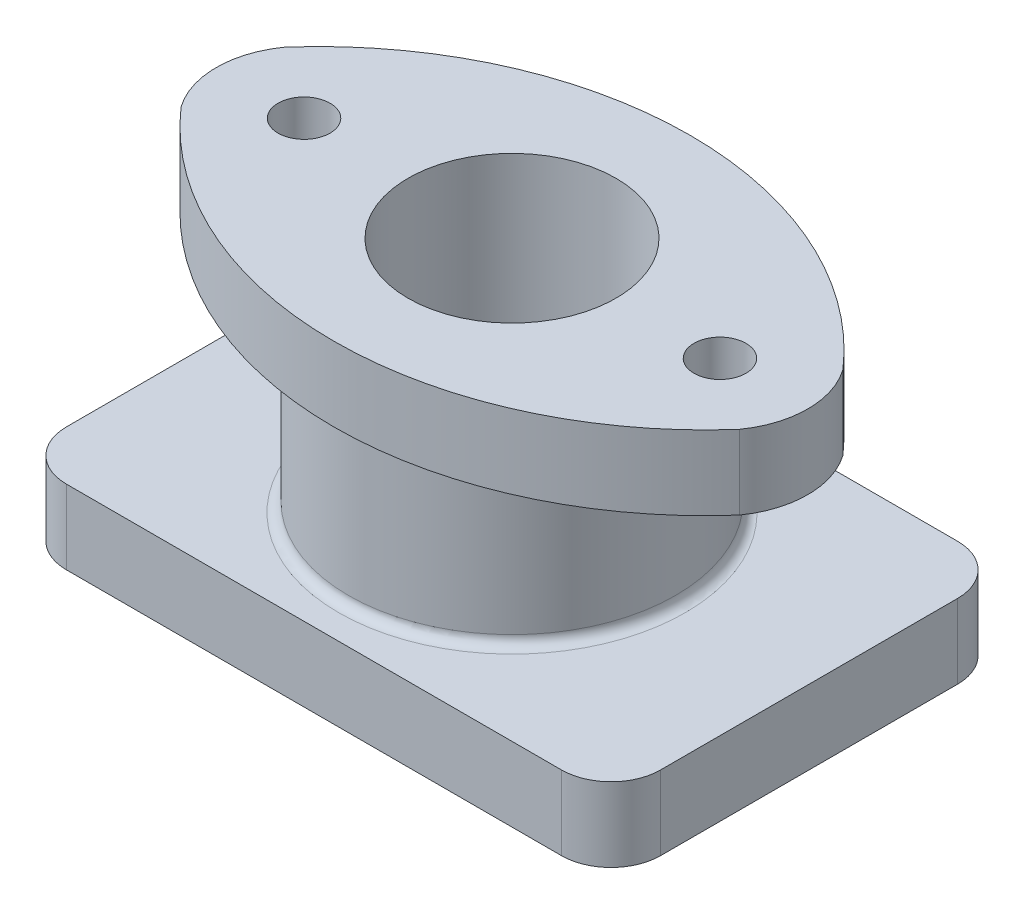
ISO-10303-21;
HEADER;
FILE_DESCRIPTION(('STEP AP214'),'2;1');
FILE_NAME('part.step','',(''),(''),'','','');
FILE_SCHEMA(('AUTOMOTIVE_DESIGN { 1 0 10303 214 1 1 1 1 }'));
ENDSEC;
DATA;
#1=APPLICATION_CONTEXT('core data for automotive mechanical design processes');
#2=APPLICATION_PROTOCOL_DEFINITION('international standard','automotive_design',2000,#1);
#3=PRODUCT_CONTEXT('',#1,'mechanical');
#4=PRODUCT('Part','Part','',(#3));
#5=PRODUCT_RELATED_PRODUCT_CATEGORY('part','',(#4));
#6=PRODUCT_DEFINITION_FORMATION('','',#4);
#7=PRODUCT_DEFINITION_CONTEXT('part definition',#1,'design');
#8=PRODUCT_DEFINITION('design','',#6,#7);
#9=PRODUCT_DEFINITION_SHAPE('','',#8);
#10=(LENGTH_UNIT() NAMED_UNIT(*) SI_UNIT(.MILLI.,.METRE.));
#11=(NAMED_UNIT(*) PLANE_ANGLE_UNIT() SI_UNIT($,.RADIAN.));
#12=(NAMED_UNIT(*) SI_UNIT($,.STERADIAN.) SOLID_ANGLE_UNIT());
#13=UNCERTAINTY_MEASURE_WITH_UNIT(LENGTH_MEASURE(1.E-05),#10,'distance_accuracy_value','');
#14=(GEOMETRIC_REPRESENTATION_CONTEXT(3) GLOBAL_UNCERTAINTY_ASSIGNED_CONTEXT((#13)) GLOBAL_UNIT_ASSIGNED_CONTEXT((#10,
#11,#12)) REPRESENTATION_CONTEXT('',''));
#15=CARTESIAN_POINT('',(0.,0.,0.));
#16=DIRECTION('',(0.,0.,1.));
#17=DIRECTION('',(1.,0.,0.));
#18=AXIS2_PLACEMENT_3D('',#15,#16,#17);
#19=CARTESIAN_POINT('',(-20.866626987407,63.,19.5));
#20=DIRECTION('',(0.,-1.,0.));
#21=DIRECTION('',(0.,0.,-1.));
#22=AXIS2_PLACEMENT_3D('',#19,#20,#21);
#23=PLANE('',#22);
#24=CARTESIAN_POINT('',(-42.,63.,0.));
#25=DIRECTION('',(0.,1.,0.));
#26=DIRECTION('',(0.,0.,1.));
#27=AXIS2_PLACEMENT_3D('',#24,#25,#26);
#28=CIRCLE('',#27,5.24999999999999);
#29=CARTESIAN_POINT('',(-42.,63.,5.24999999999999));
#30=VERTEX_POINT('',#29);
#31=EDGE_CURVE('E525',#30,#30,#28,.T.);
#32=ORIENTED_EDGE('',*,*,#31,.F.);
#33=EDGE_LOOP('',(#32));
#34=FACE_BOUND('',#33,.T.);
#35=CARTESIAN_POINT('',(0.,63.,0.));
#36=DIRECTION('',(0.,1.,0.));
#37=DIRECTION('',(0.,0.,1.));
#38=AXIS2_PLACEMENT_3D('',#35,#36,#37);
#39=CIRCLE('',#38,21.);
#40=CARTESIAN_POINT('',(0.,63.,21.));
#41=VERTEX_POINT('',#40);
#42=EDGE_CURVE('E491',#41,#41,#39,.T.);
#43=ORIENTED_EDGE('',*,*,#42,.F.);
#44=EDGE_LOOP('',(#43));
#45=FACE_BOUND('',#44,.T.);
#46=CARTESIAN_POINT('',(-41.7332539748139,63.,0.));
#47=DIRECTION('',(0.,1.,0.));
#48=DIRECTION('',(0.,0.,-1.));
#49=AXIS2_PLACEMENT_3D('',#46,#47,#48);
#50=CIRCLE('',#49,18.);
#51=CARTESIAN_POINT('',(-56.3910463339918,63.,-10.4474457718251));
#52=VERTEX_POINT('',#51);
#53=CARTESIAN_POINT('',(-56.3910463339919,63.,10.4474457718251));
#54=VERTEX_POINT('',#53);
#55=EDGE_CURVE('E137',#52,#54,#50,.T.);
#56=ORIENTED_EDGE('',*,*,#55,.T.);
#57=CARTESIAN_POINT('',(0.,63.,-39.));
#58=DIRECTION('',(0.,1.,0.));
#59=DIRECTION('',(0.,0.,1.));
#60=AXIS2_PLACEMENT_3D('',#57,#58,#59);
#61=CIRCLE('',#60,75.);
#62=CARTESIAN_POINT('',(56.3910463339916,63.,10.447445771825));
#63=VERTEX_POINT('',#62);
#64=EDGE_CURVE('E126',#54,#63,#61,.T.);
#65=ORIENTED_EDGE('',*,*,#64,.T.);
#66=CARTESIAN_POINT('',(41.7332539748139,63.,-4.58128024125748E-13));
#67=DIRECTION('',(0.,1.,0.));
#68=DIRECTION('',(0.,0.,1.));
#69=AXIS2_PLACEMENT_3D('',#66,#67,#68);
#70=CIRCLE('',#69,18.);
#71=CARTESIAN_POINT('',(56.3910463339918,63.,-10.4474457718251));
#72=VERTEX_POINT('',#71);
#73=EDGE_CURVE('E136',#63,#72,#70,.T.);
#74=ORIENTED_EDGE('',*,*,#73,.T.);
#75=CARTESIAN_POINT('',(0.,63.,39.));
#76=DIRECTION('',(0.,1.,0.));
#77=DIRECTION('',(0.,0.,-1.));
#78=AXIS2_PLACEMENT_3D('',#75,#76,#77);
#79=CIRCLE('',#78,75.);
#80=EDGE_CURVE('E142',#72,#52,#79,.T.);
#81=ORIENTED_EDGE('',*,*,#80,.T.);
#82=EDGE_LOOP('',(#56,#65,#74,#81));
#83=FACE_BOUND('',#82,.T.);
#84=CARTESIAN_POINT('',(42.,63.,0.));
#85=DIRECTION('',(0.,1.,0.));
#86=DIRECTION('',(0.,0.,1.));
#87=AXIS2_PLACEMENT_3D('',#84,#85,#86);
#88=CIRCLE('',#87,5.24999999999999);
#89=CARTESIAN_POINT('',(42.,63.,5.24999999999996));
#90=VERTEX_POINT('',#89);
#91=EDGE_CURVE('E519',#90,#90,#88,.T.);
#92=ORIENTED_EDGE('',*,*,#91,.F.);
#93=EDGE_LOOP('',(#92));
#94=FACE_BOUND('',#93,.T.);
#95=ADVANCED_FACE('F37',(#34,#45,#83,#94),#23,.F.);
#96=CARTESIAN_POINT('',(60.0000000000001,15.,-40.));
#97=DIRECTION('',(-1.,0.,0.));
#98=DIRECTION('',(0.,0.,1.));
#99=AXIS2_PLACEMENT_3D('',#96,#97,#98);
#100=PLANE('',#99);
#101=DIRECTION('',(0.,0.,-1.));
#102=VECTOR('',#101,1.);
#103=CARTESIAN_POINT('',(60.0000000000001,0.,-40.));
#104=LINE('',#103,#102);
#105=CARTESIAN_POINT('',(59.9999999999997,0.,30.0000000000001));
#106=VERTEX_POINT('',#105);
#107=CARTESIAN_POINT('',(60.,0.,-29.9999999999999));
#108=VERTEX_POINT('',#107);
#109=EDGE_CURVE('E151',#106,#108,#104,.T.);
#110=ORIENTED_EDGE('',*,*,#109,.T.);
#111=DIRECTION('',(0.,-1.,0.));
#112=VECTOR('',#111,1.);
#113=CARTESIAN_POINT('',(60.,15.,-29.9999999999999));
#114=LINE('',#113,#112);
#115=CARTESIAN_POINT('',(60.,15.,-29.9999999999999));
#116=VERTEX_POINT('',#115);
#117=EDGE_CURVE('E217',#108,#116,#114,.F.);
#118=ORIENTED_EDGE('',*,*,#117,.T.);
#119=DIRECTION('',(0.,0.,-1.));
#120=VECTOR('',#119,1.);
#121=CARTESIAN_POINT('',(60.0000000000001,15.,-40.));
#122=LINE('',#121,#120);
#123=CARTESIAN_POINT('',(59.9999999999997,15.,30.0000000000001));
#124=VERTEX_POINT('',#123);
#125=EDGE_CURVE('E160',#124,#116,#122,.T.);
#126=ORIENTED_EDGE('',*,*,#125,.F.);
#127=DIRECTION('',(0.,-1.,0.));
#128=VECTOR('',#127,1.);
#129=CARTESIAN_POINT('',(59.9999999999997,15.,30.0000000000001));
#130=LINE('',#129,#128);
#131=EDGE_CURVE('E214',#124,#106,#130,.T.);
#132=ORIENTED_EDGE('',*,*,#131,.T.);
#133=EDGE_LOOP('',(#110,#118,#126,#132));
#134=FACE_BOUND('',#133,.T.);
#135=ADVANCED_FACE('F233',(#134),#100,.F.);
#136=CARTESIAN_POINT('',(-60.0000000000005,15.,-40.));
#137=DIRECTION('',(0.,0.,1.));
#138=DIRECTION('',(1.,0.,0.));
#139=AXIS2_PLACEMENT_3D('',#136,#137,#138);
#140=PLANE('',#139);
#141=DIRECTION('',(-1.,0.,0.));
#142=VECTOR('',#141,1.);
#143=CARTESIAN_POINT('',(-60.0000000000005,0.,-40.));
#144=LINE('',#143,#142);
#145=CARTESIAN_POINT('',(50.,0.,-40.));
#146=VERTEX_POINT('',#145);
#147=CARTESIAN_POINT('',(-50.0000000000005,0.,-40.));
#148=VERTEX_POINT('',#147);
#149=EDGE_CURVE('E154',#146,#148,#144,.T.);
#150=ORIENTED_EDGE('',*,*,#149,.T.);
#151=DIRECTION('',(0.,-1.,0.));
#152=VECTOR('',#151,1.);
#153=CARTESIAN_POINT('',(-50.0000000000005,15.,-40.));
#154=LINE('',#153,#152);
#155=CARTESIAN_POINT('',(-50.0000000000005,15.,-40.));
#156=VERTEX_POINT('',#155);
#157=EDGE_CURVE('E205',#148,#156,#154,.F.);
#158=ORIENTED_EDGE('',*,*,#157,.T.);
#159=DIRECTION('',(-1.,0.,0.));
#160=VECTOR('',#159,1.);
#161=CARTESIAN_POINT('',(-60.0000000000005,15.,-40.));
#162=LINE('',#161,#160);
#163=CARTESIAN_POINT('',(50.,15.,-40.));
#164=VERTEX_POINT('',#163);
#165=EDGE_CURVE('E163',#164,#156,#162,.T.);
#166=ORIENTED_EDGE('',*,*,#165,.F.);
#167=DIRECTION('',(0.,-1.,0.));
#168=VECTOR('',#167,1.);
#169=CARTESIAN_POINT('',(50.,15.,-40.));
#170=LINE('',#169,#168);
#171=EDGE_CURVE('E202',#164,#146,#170,.T.);
#172=ORIENTED_EDGE('',*,*,#171,.T.);
#173=EDGE_LOOP('',(#150,#158,#166,#172));
#174=FACE_BOUND('',#173,.T.);
#175=ADVANCED_FACE('F243',(#174),#140,.F.);
#176=CARTESIAN_POINT('',(-60.0000000000005,15.,-40.));
#177=DIRECTION('',(1.,0.,0.));
#178=DIRECTION('',(0.,0.,-1.));
#179=AXIS2_PLACEMENT_3D('',#176,#177,#178);
#180=PLANE('',#179);
#181=DIRECTION('',(0.,0.,1.));
#182=VECTOR('',#181,1.);
#183=CARTESIAN_POINT('',(-60.0000000000005,15.,-40.));
#184=LINE('',#183,#182);
#185=CARTESIAN_POINT('',(-60.0000000000005,15.,-30.));
#186=VERTEX_POINT('',#185);
#187=CARTESIAN_POINT('',(-60.0000000000005,15.,30.));
#188=VERTEX_POINT('',#187);
#189=EDGE_CURVE('E167',#186,#188,#184,.T.);
#190=ORIENTED_EDGE('',*,*,#189,.F.);
#191=DIRECTION('',(0.,-1.,0.));
#192=VECTOR('',#191,1.);
#193=CARTESIAN_POINT('',(-60.0000000000005,15.,-30.));
#194=LINE('',#193,#192);
#195=CARTESIAN_POINT('',(-60.0000000000005,0.,-30.));
#196=VERTEX_POINT('',#195);
#197=EDGE_CURVE('E191',#186,#196,#194,.T.);
#198=ORIENTED_EDGE('',*,*,#197,.T.);
#199=DIRECTION('',(0.,0.,1.));
#200=VECTOR('',#199,1.);
#201=CARTESIAN_POINT('',(-60.0000000000005,0.,-40.));
#202=LINE('',#201,#200);
#203=CARTESIAN_POINT('',(-60.0000000000005,0.,30.));
#204=VERTEX_POINT('',#203);
#205=EDGE_CURVE('E174',#196,#204,#202,.T.);
#206=ORIENTED_EDGE('',*,*,#205,.T.);
#207=DIRECTION('',(0.,-1.,0.));
#208=VECTOR('',#207,1.);
#209=CARTESIAN_POINT('',(-60.0000000000005,15.,30.));
#210=LINE('',#209,#208);
#211=EDGE_CURVE('E189',#204,#188,#210,.F.);
#212=ORIENTED_EDGE('',*,*,#211,.T.);
#213=EDGE_LOOP('',(#190,#198,#206,#212));
#214=FACE_BOUND('',#213,.T.);
#215=ADVANCED_FACE('F251',(#214),#180,.F.);
#216=CARTESIAN_POINT('',(-60.0000000000005,15.,40.));
#217=DIRECTION('',(0.,0.,-1.));
#218=DIRECTION('',(-1.,0.,0.));
#219=AXIS2_PLACEMENT_3D('',#216,#217,#218);
#220=PLANE('',#219);
#221=DIRECTION('',(1.,0.,0.));
#222=VECTOR('',#221,1.);
#223=CARTESIAN_POINT('',(-60.0000000000005,0.,40.));
#224=LINE('',#223,#222);
#225=CARTESIAN_POINT('',(-50.0000000000005,0.,40.));
#226=VERTEX_POINT('',#225);
#227=CARTESIAN_POINT('',(49.9999999999997,0.,40.));
#228=VERTEX_POINT('',#227);
#229=EDGE_CURVE('E164',#226,#228,#224,.T.);
#230=ORIENTED_EDGE('',*,*,#229,.T.);
#231=DIRECTION('',(0.,-1.,0.));
#232=VECTOR('',#231,1.);
#233=CARTESIAN_POINT('',(49.9999999999997,15.,40.));
#234=LINE('',#233,#232);
#235=CARTESIAN_POINT('',(49.9999999999997,15.,40.));
#236=VERTEX_POINT('',#235);
#237=EDGE_CURVE('E11',#228,#236,#234,.F.);
#238=ORIENTED_EDGE('',*,*,#237,.T.);
#239=DIRECTION('',(1.,0.,0.));
#240=VECTOR('',#239,1.);
#241=CARTESIAN_POINT('',(-60.0000000000005,15.,40.));
#242=LINE('',#241,#240);
#243=CARTESIAN_POINT('',(-50.0000000000005,15.,40.));
#244=VERTEX_POINT('',#243);
#245=EDGE_CURVE('E169',#244,#236,#242,.T.);
#246=ORIENTED_EDGE('',*,*,#245,.F.);
#247=DIRECTION('',(0.,-1.,0.));
#248=VECTOR('',#247,1.);
#249=CARTESIAN_POINT('',(-50.0000000000005,15.,40.));
#250=LINE('',#249,#248);
#251=EDGE_CURVE('E45',#244,#226,#250,.T.);
#252=ORIENTED_EDGE('',*,*,#251,.T.);
#253=EDGE_LOOP('',(#230,#238,#246,#252));
#254=FACE_BOUND('',#253,.T.);
#255=ADVANCED_FACE('F221',(#254),#220,.F.);
#256=CARTESIAN_POINT('',(0.,15.,0.));
#257=DIRECTION('',(0.,1.,0.));
#258=DIRECTION('',(0.,0.,1.));
#259=AXIS2_PLACEMENT_3D('',#256,#257,#258);
#260=PLANE('',#259);
#261=CARTESIAN_POINT('',(0.,15.,0.));
#262=DIRECTION('',(0.,1.,0.));
#263=DIRECTION('',(0.,0.,1.));
#264=AXIS2_PLACEMENT_3D('',#261,#262,#263);
#265=CIRCLE('',#264,35.);
#266=CARTESIAN_POINT('',(0.,15.,35.));
#267=VERTEX_POINT('',#266);
#268=EDGE_CURVE('E170',#267,#267,#265,.F.);
#269=ORIENTED_EDGE('',*,*,#268,.T.);
#270=EDGE_LOOP('',(#269));
#271=FACE_BOUND('',#270,.T.);
#272=ORIENTED_EDGE('',*,*,#165,.T.);
#273=CARTESIAN_POINT('',(-50.0000000000005,15.,-30.));
#274=DIRECTION('',(0.,1.,0.));
#275=DIRECTION('',(0.,0.,1.));
#276=AXIS2_PLACEMENT_3D('',#273,#274,#275);
#277=CIRCLE('',#276,10.);
#278=EDGE_CURVE('E212',#156,#186,#277,.T.);
#279=ORIENTED_EDGE('',*,*,#278,.T.);
#280=ORIENTED_EDGE('',*,*,#189,.T.);
#281=CARTESIAN_POINT('',(-50.0000000000005,15.,30.));
#282=DIRECTION('',(0.,1.,0.));
#283=DIRECTION('',(0.,0.,1.));
#284=AXIS2_PLACEMENT_3D('',#281,#282,#283);
#285=CIRCLE('',#284,10.);
#286=EDGE_CURVE('E57',#188,#244,#285,.T.);
#287=ORIENTED_EDGE('',*,*,#286,.T.);
#288=ORIENTED_EDGE('',*,*,#245,.T.);
#289=CARTESIAN_POINT('',(49.9999999999997,15.,30.));
#290=DIRECTION('',(0.,1.,0.));
#291=DIRECTION('',(0.,0.,1.));
#292=AXIS2_PLACEMENT_3D('',#289,#290,#291);
#293=CIRCLE('',#292,10.);
#294=EDGE_CURVE('E208',#236,#124,#293,.T.);
#295=ORIENTED_EDGE('',*,*,#294,.T.);
#296=ORIENTED_EDGE('',*,*,#125,.T.);
#297=CARTESIAN_POINT('',(50.,15.,-30.));
#298=DIRECTION('',(0.,1.,0.));
#299=DIRECTION('',(0.,0.,1.));
#300=AXIS2_PLACEMENT_3D('',#297,#298,#299);
#301=CIRCLE('',#300,10.);
#302=EDGE_CURVE('E210',#116,#164,#301,.T.);
#303=ORIENTED_EDGE('',*,*,#302,.T.);
#304=EDGE_LOOP('',(#272,#279,#280,#287,#288,#295,#296,#303));
#305=FACE_BOUND('',#304,.T.);
#306=ADVANCED_FACE('F236',(#271,#305),#260,.T.);
#307=CARTESIAN_POINT('',(0.,0.,0.));
#308=DIRECTION('',(0.,1.,0.));
#309=DIRECTION('',(0.,0.,1.));
#310=AXIS2_PLACEMENT_3D('',#307,#308,#309);
#311=PLANE('',#310);
#312=CARTESIAN_POINT('',(0.,0.,0.));
#313=DIRECTION('',(0.,1.,0.));
#314=DIRECTION('',(0.,0.,1.));
#315=AXIS2_PLACEMENT_3D('',#312,#313,#314);
#316=CIRCLE('',#315,16.5);
#317=CARTESIAN_POINT('',(0.,0.,16.5));
#318=VERTEX_POINT('',#317);
#319=EDGE_CURVE('E492',#318,#318,#316,.T.);
#320=ORIENTED_EDGE('',*,*,#319,.T.);
#321=EDGE_LOOP('',(#320));
#322=FACE_BOUND('',#321,.T.);
#323=ORIENTED_EDGE('',*,*,#205,.F.);
#324=CARTESIAN_POINT('',(-50.0000000000005,0.,-30.));
#325=DIRECTION('',(0.,1.,0.));
#326=DIRECTION('',(0.,0.,1.));
#327=AXIS2_PLACEMENT_3D('',#324,#325,#326);
#328=CIRCLE('',#327,10.);
#329=EDGE_CURVE('E200',#196,#148,#328,.F.);
#330=ORIENTED_EDGE('',*,*,#329,.T.);
#331=ORIENTED_EDGE('',*,*,#149,.F.);
#332=CARTESIAN_POINT('',(50.,0.,-30.));
#333=DIRECTION('',(0.,1.,0.));
#334=DIRECTION('',(0.,0.,1.));
#335=AXIS2_PLACEMENT_3D('',#332,#333,#334);
#336=CIRCLE('',#335,10.);
#337=EDGE_CURVE('E198',#146,#108,#336,.F.);
#338=ORIENTED_EDGE('',*,*,#337,.T.);
#339=ORIENTED_EDGE('',*,*,#109,.F.);
#340=CARTESIAN_POINT('',(49.9999999999997,0.,30.));
#341=DIRECTION('',(0.,1.,0.));
#342=DIRECTION('',(0.,0.,1.));
#343=AXIS2_PLACEMENT_3D('',#340,#341,#342);
#344=CIRCLE('',#343,10.);
#345=EDGE_CURVE('E196',#106,#228,#344,.F.);
#346=ORIENTED_EDGE('',*,*,#345,.T.);
#347=ORIENTED_EDGE('',*,*,#229,.F.);
#348=CARTESIAN_POINT('',(-50.0000000000005,0.,30.));
#349=DIRECTION('',(0.,1.,0.));
#350=DIRECTION('',(0.,0.,1.));
#351=AXIS2_PLACEMENT_3D('',#348,#349,#350);
#352=CIRCLE('',#351,10.);
#353=EDGE_CURVE('E194',#226,#204,#352,.F.);
#354=ORIENTED_EDGE('',*,*,#353,.T.);
#355=EDGE_LOOP('',(#323,#330,#331,#338,#339,#346,#347,#354));
#356=FACE_BOUND('',#355,.T.);
#357=ADVANCED_FACE('F225',(#322,#356),#311,.F.);
#358=CARTESIAN_POINT('',(0.,48.,0.));
#359=DIRECTION('',(0.,-1.,0.));
#360=DIRECTION('',(0.,0.,-1.));
#361=AXIS2_PLACEMENT_3D('',#358,#359,#360);
#362=CYLINDRICAL_SURFACE('',#361,33.);
#363=CARTESIAN_POINT('',(0.,17.,0.));
#364=DIRECTION('',(0.,1.,0.));
#365=DIRECTION('',(0.,0.,1.));
#366=AXIS2_PLACEMENT_3D('',#363,#364,#365);
#367=CIRCLE('',#366,33.);
#368=CARTESIAN_POINT('',(0.,17.,33.));
#369=VERTEX_POINT('',#368);
#370=EDGE_CURVE('E183',#369,#369,#367,.T.);
#371=ORIENTED_EDGE('',*,*,#370,.T.);
#372=EDGE_LOOP('',(#371));
#373=FACE_BOUND('',#372,.T.);
#374=CARTESIAN_POINT('',(0.,46.,0.));
#375=DIRECTION('',(0.,-1.,0.));
#376=DIRECTION('',(0.,0.,-1.));
#377=AXIS2_PLACEMENT_3D('',#374,#375,#376);
#378=CIRCLE('',#377,33.);
#379=CARTESIAN_POINT('',(0.,46.,-33.));
#380=VERTEX_POINT('',#379);
#381=EDGE_CURVE('E180',#380,#380,#378,.T.);
#382=ORIENTED_EDGE('',*,*,#381,.T.);
#383=EDGE_LOOP('',(#382));
#384=FACE_BOUND('',#383,.T.);
#385=ADVANCED_FACE('F286',(#373,#384),#362,.T.);
#386=CARTESIAN_POINT('',(-41.7332539748139,63.,0.));
#387=DIRECTION('',(0.,-1.,0.));
#388=DIRECTION('',(0.,0.,-1.));
#389=AXIS2_PLACEMENT_3D('',#386,#387,#388);
#390=CYLINDRICAL_SURFACE('',#389,18.);
#391=CARTESIAN_POINT('',(-41.7332539748139,48.,0.));
#392=DIRECTION('',(0.,1.,0.));
#393=DIRECTION('',(0.,0.,-1.));
#394=AXIS2_PLACEMENT_3D('',#391,#392,#393);
#395=CIRCLE('',#394,18.);
#396=CARTESIAN_POINT('',(-56.3910463339918,48.,-10.4474457718251));
#397=VERTEX_POINT('',#396);
#398=CARTESIAN_POINT('',(-56.3910463339919,48.,10.4474457718251));
#399=VERTEX_POINT('',#398);
#400=EDGE_CURVE('E150',#397,#399,#395,.T.);
#401=ORIENTED_EDGE('',*,*,#400,.T.);
#402=DIRECTION('',(0.,-1.,0.));
#403=VECTOR('',#402,1.);
#404=CARTESIAN_POINT('',(-56.3910463339919,63.,10.4474457718251));
#405=LINE('',#404,#403);
#406=EDGE_CURVE('E130',#54,#399,#405,.T.);
#407=ORIENTED_EDGE('',*,*,#406,.F.);
#408=ORIENTED_EDGE('',*,*,#55,.F.);
#409=DIRECTION('',(0.,-1.,0.));
#410=VECTOR('',#409,1.);
#411=CARTESIAN_POINT('',(-56.3910463339918,63.,-10.4474457718251));
#412=LINE('',#411,#410);
#413=EDGE_CURVE('E502',#52,#397,#412,.T.);
#414=ORIENTED_EDGE('',*,*,#413,.T.);
#415=EDGE_LOOP('',(#401,#407,#408,#414));
#416=FACE_BOUND('',#415,.T.);
#417=ADVANCED_FACE('F148',(#416),#390,.T.);
#418=CARTESIAN_POINT('',(0.,63.,-39.));
#419=DIRECTION('',(0.,-1.,0.));
#420=DIRECTION('',(0.,0.,-1.));
#421=AXIS2_PLACEMENT_3D('',#418,#419,#420);
#422=CYLINDRICAL_SURFACE('',#421,75.);
#423=CARTESIAN_POINT('',(0.,48.,-39.));
#424=DIRECTION('',(0.,1.,0.));
#425=DIRECTION('',(0.,0.,1.));
#426=AXIS2_PLACEMENT_3D('',#423,#424,#425);
#427=CIRCLE('',#426,75.);
#428=CARTESIAN_POINT('',(56.3910463339916,48.,10.447445771825));
#429=VERTEX_POINT('',#428);
#430=EDGE_CURVE('E504',#399,#429,#427,.T.);
#431=ORIENTED_EDGE('',*,*,#430,.T.);
#432=DIRECTION('',(0.,-1.,0.));
#433=VECTOR('',#432,1.);
#434=CARTESIAN_POINT('',(56.3910463339916,63.,10.447445771825));
#435=LINE('',#434,#433);
#436=EDGE_CURVE('E133',#63,#429,#435,.T.);
#437=ORIENTED_EDGE('',*,*,#436,.F.);
#438=ORIENTED_EDGE('',*,*,#64,.F.);
#439=ORIENTED_EDGE('',*,*,#406,.T.);
#440=EDGE_LOOP('',(#431,#437,#438,#439));
#441=FACE_BOUND('',#440,.T.);
#442=ADVANCED_FACE('F128',(#441),#422,.T.);
#443=CARTESIAN_POINT('',(41.7332539748139,63.,-4.58128024125748E-13));
#444=DIRECTION('',(0.,-1.,0.));
#445=DIRECTION('',(0.,0.,-1.));
#446=AXIS2_PLACEMENT_3D('',#443,#444,#445);
#447=CYLINDRICAL_SURFACE('',#446,18.);
#448=CARTESIAN_POINT('',(41.7332539748139,48.,-4.58128024125748E-13));
#449=DIRECTION('',(0.,1.,0.));
#450=DIRECTION('',(0.,0.,1.));
#451=AXIS2_PLACEMENT_3D('',#448,#449,#450);
#452=CIRCLE('',#451,18.);
#453=CARTESIAN_POINT('',(56.3910463339918,48.,-10.4474457718251));
#454=VERTEX_POINT('',#453);
#455=EDGE_CURVE('E506',#429,#454,#452,.T.);
#456=ORIENTED_EDGE('',*,*,#455,.T.);
#457=DIRECTION('',(0.,-1.,0.));
#458=VECTOR('',#457,1.);
#459=CARTESIAN_POINT('',(56.3910463339918,63.,-10.4474457718251));
#460=LINE('',#459,#458);
#461=EDGE_CURVE('E156',#72,#454,#460,.T.);
#462=ORIENTED_EDGE('',*,*,#461,.F.);
#463=ORIENTED_EDGE('',*,*,#73,.F.);
#464=ORIENTED_EDGE('',*,*,#436,.T.);
#465=EDGE_LOOP('',(#456,#462,#463,#464));
#466=FACE_BOUND('',#465,.T.);
#467=ADVANCED_FACE('F277',(#466),#447,.T.);
#468=CARTESIAN_POINT('',(0.,63.,39.));
#469=DIRECTION('',(0.,-1.,0.));
#470=DIRECTION('',(0.,0.,-1.));
#471=AXIS2_PLACEMENT_3D('',#468,#469,#470);
#472=CYLINDRICAL_SURFACE('',#471,75.);
#473=CARTESIAN_POINT('',(0.,48.,39.));
#474=DIRECTION('',(0.,1.,0.));
#475=DIRECTION('',(0.,0.,-1.));
#476=AXIS2_PLACEMENT_3D('',#473,#474,#475);
#477=CIRCLE('',#476,75.);
#478=EDGE_CURVE('E146',#454,#397,#477,.T.);
#479=ORIENTED_EDGE('',*,*,#478,.T.);
#480=ORIENTED_EDGE('',*,*,#413,.F.);
#481=ORIENTED_EDGE('',*,*,#80,.F.);
#482=ORIENTED_EDGE('',*,*,#461,.T.);
#483=EDGE_LOOP('',(#479,#480,#481,#482));
#484=FACE_BOUND('',#483,.T.);
#485=ADVANCED_FACE('F273',(#484),#472,.T.);
#486=CARTESIAN_POINT('',(-20.866626987407,48.,19.5));
#487=DIRECTION('',(0.,-1.,0.));
#488=DIRECTION('',(0.,0.,-1.));
#489=AXIS2_PLACEMENT_3D('',#486,#487,#488);
#490=PLANE('',#489);
#491=CARTESIAN_POINT('',(0.,48.,0.));
#492=DIRECTION('',(0.,-1.,0.));
#493=DIRECTION('',(0.,0.,-1.));
#494=AXIS2_PLACEMENT_3D('',#491,#492,#493);
#495=CIRCLE('',#494,35.);
#496=CARTESIAN_POINT('',(0.,48.,-35.));
#497=VERTEX_POINT('',#496);
#498=EDGE_CURVE('E186',#497,#497,#495,.F.);
#499=ORIENTED_EDGE('',*,*,#498,.T.);
#500=EDGE_LOOP('',(#499));
#501=FACE_BOUND('',#500,.T.);
#502=CARTESIAN_POINT('',(-42.,48.,0.));
#503=DIRECTION('',(0.,-1.,0.));
#504=DIRECTION('',(0.,0.,-1.));
#505=AXIS2_PLACEMENT_3D('',#502,#503,#504);
#506=CIRCLE('',#505,5.24999999999999);
#507=CARTESIAN_POINT('',(-42.,48.,-5.24999999999999));
#508=VERTEX_POINT('',#507);
#509=EDGE_CURVE('E522',#508,#508,#506,.T.);
#510=ORIENTED_EDGE('',*,*,#509,.F.);
#511=EDGE_LOOP('',(#510));
#512=FACE_BOUND('',#511,.T.);
#513=CARTESIAN_POINT('',(42.,48.,0.));
#514=DIRECTION('',(0.,-1.,0.));
#515=DIRECTION('',(0.,0.,-1.));
#516=AXIS2_PLACEMENT_3D('',#513,#514,#515);
#517=CIRCLE('',#516,5.24999999999999);
#518=CARTESIAN_POINT('',(42.,48.,-5.25000000000002));
#519=VERTEX_POINT('',#518);
#520=EDGE_CURVE('E515',#519,#519,#517,.T.);
#521=ORIENTED_EDGE('',*,*,#520,.F.);
#522=EDGE_LOOP('',(#521));
#523=FACE_BOUND('',#522,.T.);
#524=ORIENTED_EDGE('',*,*,#400,.F.);
#525=ORIENTED_EDGE('',*,*,#478,.F.);
#526=ORIENTED_EDGE('',*,*,#455,.F.);
#527=ORIENTED_EDGE('',*,*,#430,.F.);
#528=EDGE_LOOP('',(#524,#525,#526,#527));
#529=FACE_BOUND('',#528,.T.);
#530=ADVANCED_FACE('F270',(#501,#512,#523,#529),#490,.T.);
#531=CARTESIAN_POINT('',(0.,15.,0.));
#532=DIRECTION('',(0.,1.,0.));
#533=DIRECTION('',(0.,0.,1.));
#534=AXIS2_PLACEMENT_3D('',#531,#532,#533);
#535=CYLINDRICAL_SURFACE('',#534,21.);
#536=CARTESIAN_POINT('',(0.,15.,0.));
#537=DIRECTION('',(0.,1.,0.));
#538=DIRECTION('',(0.,0.,1.));
#539=AXIS2_PLACEMENT_3D('',#536,#537,#538);
#540=CIRCLE('',#539,21.);
#541=CARTESIAN_POINT('',(0.,15.,21.));
#542=VERTEX_POINT('',#541);
#543=EDGE_CURVE('E488',#542,#542,#540,.T.);
#544=ORIENTED_EDGE('',*,*,#543,.F.);
#545=EDGE_LOOP('',(#544));
#546=FACE_BOUND('',#545,.T.);
#547=ORIENTED_EDGE('',*,*,#42,.T.);
#548=EDGE_LOOP('',(#547));
#549=FACE_BOUND('',#548,.T.);
#550=ADVANCED_FACE('F268',(#546,#549),#535,.F.);
#551=CARTESIAN_POINT('',(0.,15.,0.));
#552=DIRECTION('',(0.,1.,0.));
#553=DIRECTION('',(0.,0.,1.));
#554=AXIS2_PLACEMENT_3D('',#551,#552,#553);
#555=PLANE('',#554);
#556=CARTESIAN_POINT('',(0.,15.,0.));
#557=DIRECTION('',(0.,1.,0.));
#558=DIRECTION('',(0.,0.,1.));
#559=AXIS2_PLACEMENT_3D('',#556,#557,#558);
#560=CIRCLE('',#559,16.5);
#561=CARTESIAN_POINT('',(0.,15.,16.5));
#562=VERTEX_POINT('',#561);
#563=EDGE_CURVE('E496',#562,#562,#560,.T.);
#564=ORIENTED_EDGE('',*,*,#563,.F.);
#565=EDGE_LOOP('',(#564));
#566=FACE_BOUND('',#565,.T.);
#567=ORIENTED_EDGE('',*,*,#543,.T.);
#568=EDGE_LOOP('',(#567));
#569=FACE_BOUND('',#568,.T.);
#570=ADVANCED_FACE('F384',(#566,#569),#555,.T.);
#571=CARTESIAN_POINT('',(0.,0.,0.));
#572=DIRECTION('',(0.,1.,0.));
#573=DIRECTION('',(0.,0.,1.));
#574=AXIS2_PLACEMENT_3D('',#571,#572,#573);
#575=CYLINDRICAL_SURFACE('',#574,16.5);
#576=ORIENTED_EDGE('',*,*,#319,.F.);
#577=EDGE_LOOP('',(#576));
#578=FACE_BOUND('',#577,.T.);
#579=ORIENTED_EDGE('',*,*,#563,.T.);
#580=EDGE_LOOP('',(#579));
#581=FACE_BOUND('',#580,.T.);
#582=ADVANCED_FACE('F366',(#578,#581),#575,.F.);
#583=CARTESIAN_POINT('',(42.,63.,0.));
#584=DIRECTION('',(0.,1.,0.));
#585=DIRECTION('',(0.,0.,1.));
#586=AXIS2_PLACEMENT_3D('',#583,#584,#585);
#587=CYLINDRICAL_SURFACE('',#586,5.24999999999999);
#588=ORIENTED_EDGE('',*,*,#91,.T.);
#589=EDGE_LOOP('',(#588));
#590=FACE_BOUND('',#589,.T.);
#591=ORIENTED_EDGE('',*,*,#520,.T.);
#592=EDGE_LOOP('',(#591));
#593=FACE_BOUND('',#592,.T.);
#594=ADVANCED_FACE('F355',(#590,#593),#587,.F.);
#595=CARTESIAN_POINT('',(-42.,63.,0.));
#596=DIRECTION('',(0.,1.,0.));
#597=DIRECTION('',(0.,0.,1.));
#598=AXIS2_PLACEMENT_3D('',#595,#596,#597);
#599=CYLINDRICAL_SURFACE('',#598,5.24999999999999);
#600=ORIENTED_EDGE('',*,*,#31,.T.);
#601=EDGE_LOOP('',(#600));
#602=FACE_BOUND('',#601,.T.);
#603=ORIENTED_EDGE('',*,*,#509,.T.);
#604=EDGE_LOOP('',(#603));
#605=FACE_BOUND('',#604,.T.);
#606=ADVANCED_FACE('F306',(#602,#605),#599,.F.);
#607=CARTESIAN_POINT('',(0.,17.,0.));
#608=DIRECTION('',(0.,1.,0.));
#609=DIRECTION('',(0.,0.,1.));
#610=AXIS2_PLACEMENT_3D('',#607,#608,#609);
#611=TOROIDAL_SURFACE('',#610,35.,2.);
#612=ORIENTED_EDGE('',*,*,#370,.F.);
#613=EDGE_LOOP('',(#612));
#614=FACE_BOUND('',#613,.T.);
#615=ORIENTED_EDGE('',*,*,#268,.F.);
#616=EDGE_LOOP('',(#615));
#617=FACE_BOUND('',#616,.T.);
#618=ADVANCED_FACE('F302',(#614,#617),#611,.F.);
#619=CARTESIAN_POINT('',(0.,46.,0.));
#620=DIRECTION('',(0.,-1.,0.));
#621=DIRECTION('',(0.,0.,-1.));
#622=AXIS2_PLACEMENT_3D('',#619,#620,#621);
#623=TOROIDAL_SURFACE('',#622,35.,2.);
#624=ORIENTED_EDGE('',*,*,#381,.F.);
#625=EDGE_LOOP('',(#624));
#626=FACE_BOUND('',#625,.T.);
#627=ORIENTED_EDGE('',*,*,#498,.F.);
#628=EDGE_LOOP('',(#627));
#629=FACE_BOUND('',#628,.T.);
#630=ADVANCED_FACE('F305',(#626,#629),#623,.F.);
#631=CARTESIAN_POINT('',(-50.0000000000005,15.,-30.));
#632=DIRECTION('',(0.,-1.,0.));
#633=DIRECTION('',(0.,0.,-1.));
#634=AXIS2_PLACEMENT_3D('',#631,#632,#633);
#635=CYLINDRICAL_SURFACE('',#634,10.);
#636=ORIENTED_EDGE('',*,*,#278,.F.);
#637=ORIENTED_EDGE('',*,*,#157,.F.);
#638=ORIENTED_EDGE('',*,*,#329,.F.);
#639=ORIENTED_EDGE('',*,*,#197,.F.);
#640=EDGE_LOOP('',(#636,#637,#638,#639));
#641=FACE_BOUND('',#640,.T.);
#642=ADVANCED_FACE('F248',(#641),#635,.T.);
#643=CARTESIAN_POINT('',(50.,15.,-30.));
#644=DIRECTION('',(0.,-1.,0.));
#645=DIRECTION('',(0.,0.,-1.));
#646=AXIS2_PLACEMENT_3D('',#643,#644,#645);
#647=CYLINDRICAL_SURFACE('',#646,10.);
#648=ORIENTED_EDGE('',*,*,#302,.F.);
#649=ORIENTED_EDGE('',*,*,#117,.F.);
#650=ORIENTED_EDGE('',*,*,#337,.F.);
#651=ORIENTED_EDGE('',*,*,#171,.F.);
#652=EDGE_LOOP('',(#648,#649,#650,#651));
#653=FACE_BOUND('',#652,.T.);
#654=ADVANCED_FACE('F240',(#653),#647,.T.);
#655=CARTESIAN_POINT('',(49.9999999999997,15.,30.));
#656=DIRECTION('',(0.,-1.,0.));
#657=DIRECTION('',(0.,0.,-1.));
#658=AXIS2_PLACEMENT_3D('',#655,#656,#657);
#659=CYLINDRICAL_SURFACE('',#658,10.);
#660=ORIENTED_EDGE('',*,*,#294,.F.);
#661=ORIENTED_EDGE('',*,*,#237,.F.);
#662=ORIENTED_EDGE('',*,*,#345,.F.);
#663=ORIENTED_EDGE('',*,*,#131,.F.);
#664=EDGE_LOOP('',(#660,#661,#662,#663));
#665=FACE_BOUND('',#664,.T.);
#666=ADVANCED_FACE('F230',(#665),#659,.T.);
#667=CARTESIAN_POINT('',(-50.0000000000005,15.,30.));
#668=DIRECTION('',(0.,-1.,0.));
#669=DIRECTION('',(0.,0.,-1.));
#670=AXIS2_PLACEMENT_3D('',#667,#668,#669);
#671=CYLINDRICAL_SURFACE('',#670,10.);
#672=ORIENTED_EDGE('',*,*,#286,.F.);
#673=ORIENTED_EDGE('',*,*,#211,.F.);
#674=ORIENTED_EDGE('',*,*,#353,.F.);
#675=ORIENTED_EDGE('',*,*,#251,.F.);
#676=EDGE_LOOP('',(#672,#673,#674,#675));
#677=FACE_BOUND('',#676,.T.);
#678=ADVANCED_FACE('F39',(#677),#671,.T.);
#679=CLOSED_SHELL('',(#95,#135,#175,#215,#255,#306,#357,#385,#417,#442,#467,#485,#530,#550,#570,
#582,#594,#606,#618,#630,#642,#654,#666,#678));
#680=MANIFOLD_SOLID_BREP('B2',#679);
#681=ADVANCED_BREP_SHAPE_REPRESENTATION('',(#18,#680),#14);
#682=SHAPE_DEFINITION_REPRESENTATION(#9,#681);
ENDSEC;
END-ISO-10303-21;
